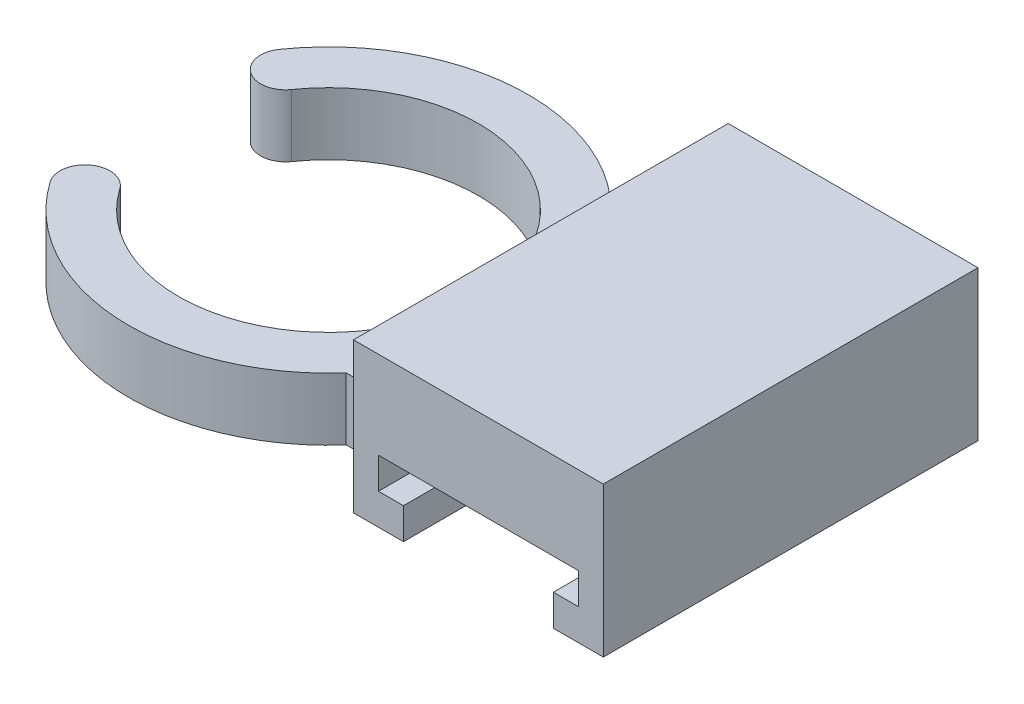
ISO-10303-21;
HEADER;
FILE_DESCRIPTION(('STEP AP214'),'2;1');
FILE_NAME('part.step','',(''),(''),'','','');
FILE_SCHEMA(('AUTOMOTIVE_DESIGN { 1 0 10303 214 1 1 1 1 }'));
ENDSEC;
DATA;
#1=APPLICATION_CONTEXT('core data for automotive mechanical design processes');
#2=APPLICATION_PROTOCOL_DEFINITION('international standard','automotive_design',2000,#1);
#3=PRODUCT_CONTEXT('',#1,'mechanical');
#4=PRODUCT('Part','Part','',(#3));
#5=PRODUCT_RELATED_PRODUCT_CATEGORY('part','',(#4));
#6=PRODUCT_DEFINITION_FORMATION('','',#4);
#7=PRODUCT_DEFINITION_CONTEXT('part definition',#1,'design');
#8=PRODUCT_DEFINITION('design','',#6,#7);
#9=PRODUCT_DEFINITION_SHAPE('','',#8);
#10=(LENGTH_UNIT() NAMED_UNIT(*) SI_UNIT(.MILLI.,.METRE.));
#11=(NAMED_UNIT(*) PLANE_ANGLE_UNIT() SI_UNIT($,.RADIAN.));
#12=(NAMED_UNIT(*) SI_UNIT($,.STERADIAN.) SOLID_ANGLE_UNIT());
#13=UNCERTAINTY_MEASURE_WITH_UNIT(LENGTH_MEASURE(1.E-05),#10,'distance_accuracy_value','');
#14=(GEOMETRIC_REPRESENTATION_CONTEXT(3) GLOBAL_UNCERTAINTY_ASSIGNED_CONTEXT((#13)) GLOBAL_UNIT_ASSIGNED_CONTEXT((#10,
#11,#12)) REPRESENTATION_CONTEXT('',''));
#15=CARTESIAN_POINT('',(0.,0.,0.));
#16=DIRECTION('',(0.,0.,1.));
#17=DIRECTION('',(1.,0.,0.));
#18=AXIS2_PLACEMENT_3D('',#15,#16,#17);
#19=CARTESIAN_POINT('',(-19.7321469764376,-1.59822046465645,60.));
#20=DIRECTION('',(1.,0.,0.));
#21=DIRECTION('',(0.,0.,-1.));
#22=AXIS2_PLACEMENT_3D('',#19,#20,#21);
#23=PLANE('',#22);
#24=DIRECTION('',(0.,-1.,0.));
#25=VECTOR('',#24,1.);
#26=CARTESIAN_POINT('',(-19.7321469764376,8.40177953534354,8.83398951148327));
#27=LINE('',#26,#25);
#28=CARTESIAN_POINT('',(-19.7321469764376,8.40177953534354,8.83398951148327));
#29=VERTEX_POINT('',#28);
#30=CARTESIAN_POINT('',(-19.7321469764376,-1.59822046465645,8.83398951148327));
#31=VERTEX_POINT('',#30);
#32=EDGE_CURVE('E295',#29,#31,#27,.T.);
#33=ORIENTED_EDGE('',*,*,#32,.F.);
#34=DIRECTION('',(0.,0.,-1.));
#35=VECTOR('',#34,1.);
#36=CARTESIAN_POINT('',(-19.7321469764376,8.40177953534354,0.));
#37=LINE('',#36,#35);
#38=CARTESIAN_POINT('',(-19.7321469764376,8.40177953534354,51.1660104885167));
#39=VERTEX_POINT('',#38);
#40=EDGE_CURVE('E280',#39,#29,#37,.T.);
#41=ORIENTED_EDGE('',*,*,#40,.F.);
#42=DIRECTION('',(0.,-1.,0.));
#43=VECTOR('',#42,1.);
#44=CARTESIAN_POINT('',(-19.7321469764376,8.40177953534354,51.1660104885167));
#45=LINE('',#44,#43);
#46=CARTESIAN_POINT('',(-19.7321469764376,-1.59822046465645,51.1660104885167));
#47=VERTEX_POINT('',#46);
#48=EDGE_CURVE('E171',#39,#47,#45,.T.);
#49=ORIENTED_EDGE('',*,*,#48,.T.);
#50=DIRECTION('',(0.,0.,-1.));
#51=VECTOR('',#50,1.);
#52=CARTESIAN_POINT('',(-19.7321469764376,-1.59822046465645,60.));
#53=LINE('',#52,#51);
#54=CARTESIAN_POINT('',(-19.7321469764376,-1.59822046465645,60.));
#55=VERTEX_POINT('',#54);
#56=EDGE_CURVE('E11',#55,#47,#53,.T.);
#57=ORIENTED_EDGE('',*,*,#56,.F.);
#58=DIRECTION('',(0.,-1.,0.));
#59=VECTOR('',#58,1.);
#60=CARTESIAN_POINT('',(-19.7321469764376,-1.59822046465645,60.));
#61=LINE('',#60,#59);
#62=CARTESIAN_POINT('',(-19.7321469764376,22.4017795353436,60.));
#63=VERTEX_POINT('',#62);
#64=EDGE_CURVE('E191',#63,#55,#61,.T.);
#65=ORIENTED_EDGE('',*,*,#64,.F.);
#66=DIRECTION('',(0.,0.,-1.));
#67=VECTOR('',#66,1.);
#68=CARTESIAN_POINT('',(-19.7321469764376,22.4017795353436,60.));
#69=LINE('',#68,#67);
#70=CARTESIAN_POINT('',(-19.7321469764376,22.4017795353436,0.));
#71=VERTEX_POINT('',#70);
#72=EDGE_CURVE('E163',#63,#71,#69,.T.);
#73=ORIENTED_EDGE('',*,*,#72,.T.);
#74=DIRECTION('',(0.,-1.,0.));
#75=VECTOR('',#74,1.);
#76=CARTESIAN_POINT('',(-19.7321469764376,-1.59822046465645,0.));
#77=LINE('',#76,#75);
#78=CARTESIAN_POINT('',(-19.7321469764376,-1.59822046465645,0.));
#79=VERTEX_POINT('',#78);
#80=EDGE_CURVE('E167',#71,#79,#77,.T.);
#81=ORIENTED_EDGE('',*,*,#80,.T.);
#82=EDGE_CURVE('E42',#31,#79,#53,.T.);
#83=ORIENTED_EDGE('',*,*,#82,.F.);
#84=EDGE_LOOP('',(#33,#41,#49,#57,#65,#73,#81,#83));
#85=FACE_BOUND('',#84,.T.);
#86=ADVANCED_FACE('F35',(#85),#23,.F.);
#87=CARTESIAN_POINT('',(-19.7321469764376,-1.59822046465645,60.));
#88=DIRECTION('',(0.,1.,0.));
#89=DIRECTION('',(0.,0.,1.));
#90=AXIS2_PLACEMENT_3D('',#87,#88,#89);
#91=PLANE('',#90);
#92=DIRECTION('',(1.,0.,0.));
#93=VECTOR('',#92,1.);
#94=CARTESIAN_POINT('',(-19.7321469764376,-1.59822046465645,0.));
#95=LINE('',#94,#93);
#96=CARTESIAN_POINT('',(-11.7321469764376,-1.59822046465645,0.));
#97=VERTEX_POINT('',#96);
#98=EDGE_CURVE('E170',#79,#97,#95,.T.);
#99=ORIENTED_EDGE('',*,*,#98,.T.);
#100=DIRECTION('',(0.,0.,-1.));
#101=VECTOR('',#100,1.);
#102=CARTESIAN_POINT('',(-11.7321469764376,-1.59822046465645,60.));
#103=LINE('',#102,#101);
#104=CARTESIAN_POINT('',(-11.7321469764376,-1.59822046465645,60.));
#105=VERTEX_POINT('',#104);
#106=EDGE_CURVE('E212',#105,#97,#103,.T.);
#107=ORIENTED_EDGE('',*,*,#106,.F.);
#108=DIRECTION('',(1.,0.,0.));
#109=VECTOR('',#108,1.);
#110=CARTESIAN_POINT('',(-19.7321469764376,-1.59822046465645,60.));
#111=LINE('',#110,#109);
#112=EDGE_CURVE('E111',#55,#105,#111,.T.);
#113=ORIENTED_EDGE('',*,*,#112,.F.);
#114=ORIENTED_EDGE('',*,*,#56,.T.);
#115=DIRECTION('',(1.,0.,0.));
#116=VECTOR('',#115,1.);
#117=CARTESIAN_POINT('',(0.,-1.59822046465645,51.1660104885167));
#118=LINE('',#117,#116);
#119=CARTESIAN_POINT('',(-29.7321469764377,-1.59822046465645,51.1660104885167));
#120=VERTEX_POINT('',#119);
#121=EDGE_CURVE('E49',#120,#47,#118,.T.);
#122=ORIENTED_EDGE('',*,*,#121,.F.);
#123=CARTESIAN_POINT('',(-53.7321469764376,-1.59822046465645,30.));
#124=DIRECTION('',(0.,-1.,0.));
#125=DIRECTION('',(0.,0.,-1.));
#126=AXIS2_PLACEMENT_3D('',#123,#124,#125);
#127=CIRCLE('',#126,32.);
#128=CARTESIAN_POINT('',(-79.9450123936855,-1.59822046465645,48.3544459632333));
#129=VERTEX_POINT('',#128);
#130=EDGE_CURVE('E312',#120,#129,#127,.T.);
#131=ORIENTED_EDGE('',*,*,#130,.T.);
#132=CARTESIAN_POINT('',(-76.6684042165295,-1.59822046465645,46.0601402178292));
#133=DIRECTION('',(0.,-1.,0.));
#134=DIRECTION('',(0.,0.,-1.));
#135=AXIS2_PLACEMENT_3D('',#132,#133,#134);
#136=CIRCLE('',#135,4.);
#137=CARTESIAN_POINT('',(-73.3917960393735,-1.59822046465645,43.765834472425));
#138=VERTEX_POINT('',#137);
#139=EDGE_CURVE('E309',#129,#138,#136,.T.);
#140=ORIENTED_EDGE('',*,*,#139,.T.);
#141=CARTESIAN_POINT('',(-53.7321469764376,-1.59822046465645,30.));
#142=DIRECTION('',(0.,-1.,0.));
#143=DIRECTION('',(0.,0.,-1.));
#144=AXIS2_PLACEMENT_3D('',#141,#142,#143);
#145=CIRCLE('',#144,24.);
#146=CARTESIAN_POINT('',(-73.3917960393735,-1.59822046465645,16.234165527575));
#147=VERTEX_POINT('',#146);
#148=EDGE_CURVE('E306',#147,#138,#145,.T.);
#149=ORIENTED_EDGE('',*,*,#148,.F.);
#150=CARTESIAN_POINT('',(-76.6684042165295,-1.59822046465645,13.9398597821708));
#151=DIRECTION('',(0.,-1.,0.));
#152=DIRECTION('',(0.,0.,-1.));
#153=AXIS2_PLACEMENT_3D('',#150,#151,#152);
#154=CIRCLE('',#153,4.);
#155=CARTESIAN_POINT('',(-79.9450123936855,-1.59822046465645,11.6455540367667));
#156=VERTEX_POINT('',#155);
#157=EDGE_CURVE('E303',#156,#147,#154,.F.);
#158=ORIENTED_EDGE('',*,*,#157,.F.);
#159=CARTESIAN_POINT('',(-53.7321469764376,-1.59822046465645,30.));
#160=DIRECTION('',(0.,-1.,0.));
#161=DIRECTION('',(0.,0.,-1.));
#162=AXIS2_PLACEMENT_3D('',#159,#160,#161);
#163=CIRCLE('',#162,32.);
#164=CARTESIAN_POINT('',(-29.7321469764377,-1.59822046465645,8.83398951148328));
#165=VERTEX_POINT('',#164);
#166=EDGE_CURVE('E301',#156,#165,#163,.T.);
#167=ORIENTED_EDGE('',*,*,#166,.T.);
#168=DIRECTION('',(-1.,0.,0.));
#169=VECTOR('',#168,1.);
#170=CARTESIAN_POINT('',(0.,-1.59822046465645,8.83398951148327));
#171=LINE('',#170,#169);
#172=EDGE_CURVE('E223',#31,#165,#171,.T.);
#173=ORIENTED_EDGE('',*,*,#172,.F.);
#174=ORIENTED_EDGE('',*,*,#82,.T.);
#175=EDGE_LOOP('',(#99,#107,#113,#114,#122,#131,#140,#149,#158,#167,#173,#174));
#176=FACE_BOUND('',#175,.T.);
#177=ADVANCED_FACE('F220',(#176),#91,.F.);
#178=CARTESIAN_POINT('',(-11.7321469764376,-1.59822046465645,60.));
#179=DIRECTION('',(-1.,0.,0.));
#180=DIRECTION('',(0.,0.,1.));
#181=AXIS2_PLACEMENT_3D('',#178,#179,#180);
#182=PLANE('',#181);
#183=DIRECTION('',(0.,1.,0.));
#184=VECTOR('',#183,1.);
#185=CARTESIAN_POINT('',(-11.7321469764376,-1.59822046465645,0.));
#186=LINE('',#185,#184);
#187=CARTESIAN_POINT('',(-11.7321469764376,3.40177953534355,0.));
#188=VERTEX_POINT('',#187);
#189=EDGE_CURVE('E173',#97,#188,#186,.T.);
#190=ORIENTED_EDGE('',*,*,#189,.T.);
#191=DIRECTION('',(0.,0.,-1.));
#192=VECTOR('',#191,1.);
#193=CARTESIAN_POINT('',(-11.7321469764376,3.40177953534355,60.));
#194=LINE('',#193,#192);
#195=CARTESIAN_POINT('',(-11.7321469764376,3.40177953534355,60.));
#196=VERTEX_POINT('',#195);
#197=EDGE_CURVE('E210',#196,#188,#194,.T.);
#198=ORIENTED_EDGE('',*,*,#197,.F.);
#199=DIRECTION('',(0.,1.,0.));
#200=VECTOR('',#199,1.);
#201=CARTESIAN_POINT('',(-11.7321469764376,-1.59822046465645,60.));
#202=LINE('',#201,#200);
#203=EDGE_CURVE('E267',#105,#196,#202,.T.);
#204=ORIENTED_EDGE('',*,*,#203,.F.);
#205=ORIENTED_EDGE('',*,*,#106,.T.);
#206=EDGE_LOOP('',(#190,#198,#204,#205));
#207=FACE_BOUND('',#206,.T.);
#208=ADVANCED_FACE('F266',(#207),#182,.F.);
#209=CARTESIAN_POINT('',(-11.7321469764376,3.40177953534355,60.));
#210=DIRECTION('',(0.,-1.,0.));
#211=DIRECTION('',(0.,0.,-1.));
#212=AXIS2_PLACEMENT_3D('',#209,#210,#211);
#213=PLANE('',#212);
#214=DIRECTION('',(-1.,0.,0.));
#215=VECTOR('',#214,1.);
#216=CARTESIAN_POINT('',(-11.7321469764376,3.40177953534355,0.));
#217=LINE('',#216,#215);
#218=CARTESIAN_POINT('',(-15.7321469764376,3.40177953534355,0.));
#219=VERTEX_POINT('',#218);
#220=EDGE_CURVE('E175',#188,#219,#217,.T.);
#221=ORIENTED_EDGE('',*,*,#220,.T.);
#222=DIRECTION('',(0.,0.,-1.));
#223=VECTOR('',#222,1.);
#224=CARTESIAN_POINT('',(-15.7321469764376,3.40177953534355,60.));
#225=LINE('',#224,#223);
#226=CARTESIAN_POINT('',(-15.7321469764376,3.40177953534355,60.));
#227=VERTEX_POINT('',#226);
#228=EDGE_CURVE('E207',#227,#219,#225,.T.);
#229=ORIENTED_EDGE('',*,*,#228,.F.);
#230=DIRECTION('',(-1.,0.,0.));
#231=VECTOR('',#230,1.);
#232=CARTESIAN_POINT('',(-11.7321469764376,3.40177953534355,60.));
#233=LINE('',#232,#231);
#234=EDGE_CURVE('E264',#196,#227,#233,.T.);
#235=ORIENTED_EDGE('',*,*,#234,.F.);
#236=ORIENTED_EDGE('',*,*,#197,.T.);
#237=EDGE_LOOP('',(#221,#229,#235,#236));
#238=FACE_BOUND('',#237,.T.);
#239=ADVANCED_FACE('F263',(#238),#213,.F.);
#240=CARTESIAN_POINT('',(-15.7321469764376,3.40177953534355,60.));
#241=DIRECTION('',(-1.,0.,0.));
#242=DIRECTION('',(0.,0.,1.));
#243=AXIS2_PLACEMENT_3D('',#240,#241,#242);
#244=PLANE('',#243);
#245=DIRECTION('',(0.,1.,0.));
#246=VECTOR('',#245,1.);
#247=CARTESIAN_POINT('',(-15.7321469764376,3.40177953534355,0.));
#248=LINE('',#247,#246);
#249=CARTESIAN_POINT('',(-15.7321469764376,8.40177953534355,0.));
#250=VERTEX_POINT('',#249);
#251=EDGE_CURVE('E177',#219,#250,#248,.T.);
#252=ORIENTED_EDGE('',*,*,#251,.T.);
#253=DIRECTION('',(0.,0.,-1.));
#254=VECTOR('',#253,1.);
#255=CARTESIAN_POINT('',(-15.7321469764376,8.40177953534355,60.));
#256=LINE('',#255,#254);
#257=CARTESIAN_POINT('',(-15.7321469764376,8.40177953534355,60.));
#258=VERTEX_POINT('',#257);
#259=EDGE_CURVE('E204',#258,#250,#256,.T.);
#260=ORIENTED_EDGE('',*,*,#259,.F.);
#261=DIRECTION('',(0.,1.,0.));
#262=VECTOR('',#261,1.);
#263=CARTESIAN_POINT('',(-15.7321469764376,3.40177953534355,60.));
#264=LINE('',#263,#262);
#265=EDGE_CURVE('E259',#227,#258,#264,.T.);
#266=ORIENTED_EDGE('',*,*,#265,.F.);
#267=ORIENTED_EDGE('',*,*,#228,.T.);
#268=EDGE_LOOP('',(#252,#260,#266,#267));
#269=FACE_BOUND('',#268,.T.);
#270=ADVANCED_FACE('F258',(#269),#244,.F.);
#271=CARTESIAN_POINT('',(-15.7321469764376,8.40177953534355,60.));
#272=DIRECTION('',(0.,1.,0.));
#273=DIRECTION('',(0.,0.,1.));
#274=AXIS2_PLACEMENT_3D('',#271,#272,#273);
#275=PLANE('',#274);
#276=DIRECTION('',(1.,0.,0.));
#277=VECTOR('',#276,1.);
#278=CARTESIAN_POINT('',(-15.7321469764376,8.40177953534355,0.));
#279=LINE('',#278,#277);
#280=CARTESIAN_POINT('',(16.2678530235624,8.40177953534355,0.));
#281=VERTEX_POINT('',#280);
#282=EDGE_CURVE('E179',#250,#281,#279,.T.);
#283=ORIENTED_EDGE('',*,*,#282,.T.);
#284=DIRECTION('',(0.,0.,-1.));
#285=VECTOR('',#284,1.);
#286=CARTESIAN_POINT('',(16.2678530235624,8.40177953534355,60.));
#287=LINE('',#286,#285);
#288=CARTESIAN_POINT('',(16.2678530235624,8.40177953534355,60.));
#289=VERTEX_POINT('',#288);
#290=EDGE_CURVE('E201',#289,#281,#287,.T.);
#291=ORIENTED_EDGE('',*,*,#290,.F.);
#292=DIRECTION('',(1.,0.,0.));
#293=VECTOR('',#292,1.);
#294=CARTESIAN_POINT('',(-15.7321469764376,8.40177953534355,60.));
#295=LINE('',#294,#293);
#296=EDGE_CURVE('E255',#258,#289,#295,.T.);
#297=ORIENTED_EDGE('',*,*,#296,.F.);
#298=ORIENTED_EDGE('',*,*,#259,.T.);
#299=EDGE_LOOP('',(#283,#291,#297,#298));
#300=FACE_BOUND('',#299,.T.);
#301=ADVANCED_FACE('F252',(#300),#275,.F.);
#302=CARTESIAN_POINT('',(16.2678530235624,3.40177953534355,60.));
#303=DIRECTION('',(1.,0.,0.));
#304=DIRECTION('',(0.,0.,-1.));
#305=AXIS2_PLACEMENT_3D('',#302,#303,#304);
#306=PLANE('',#305);
#307=DIRECTION('',(0.,-1.,0.));
#308=VECTOR('',#307,1.);
#309=CARTESIAN_POINT('',(16.2678530235624,3.40177953534355,0.));
#310=LINE('',#309,#308);
#311=CARTESIAN_POINT('',(16.2678530235624,3.40177953534355,0.));
#312=VERTEX_POINT('',#311);
#313=EDGE_CURVE('E181',#281,#312,#310,.T.);
#314=ORIENTED_EDGE('',*,*,#313,.T.);
#315=DIRECTION('',(0.,0.,-1.));
#316=VECTOR('',#315,1.);
#317=CARTESIAN_POINT('',(16.2678530235624,3.40177953534355,60.));
#318=LINE('',#317,#316);
#319=CARTESIAN_POINT('',(16.2678530235624,3.40177953534355,60.));
#320=VERTEX_POINT('',#319);
#321=EDGE_CURVE('E198',#320,#312,#318,.T.);
#322=ORIENTED_EDGE('',*,*,#321,.F.);
#323=DIRECTION('',(0.,-1.,0.));
#324=VECTOR('',#323,1.);
#325=CARTESIAN_POINT('',(16.2678530235624,3.40177953534355,60.));
#326=LINE('',#325,#324);
#327=EDGE_CURVE('E247',#289,#320,#326,.T.);
#328=ORIENTED_EDGE('',*,*,#327,.F.);
#329=ORIENTED_EDGE('',*,*,#290,.T.);
#330=EDGE_LOOP('',(#314,#322,#328,#329));
#331=FACE_BOUND('',#330,.T.);
#332=ADVANCED_FACE('F246',(#331),#306,.F.);
#333=CARTESIAN_POINT('',(12.2678530235624,3.40177953534355,60.));
#334=DIRECTION('',(0.,-1.,0.));
#335=DIRECTION('',(0.,0.,-1.));
#336=AXIS2_PLACEMENT_3D('',#333,#334,#335);
#337=PLANE('',#336);
#338=DIRECTION('',(-1.,0.,0.));
#339=VECTOR('',#338,1.);
#340=CARTESIAN_POINT('',(12.2678530235624,3.40177953534355,0.));
#341=LINE('',#340,#339);
#342=CARTESIAN_POINT('',(12.2678530235624,3.40177953534355,0.));
#343=VERTEX_POINT('',#342);
#344=EDGE_CURVE('E183',#312,#343,#341,.T.);
#345=ORIENTED_EDGE('',*,*,#344,.T.);
#346=DIRECTION('',(0.,0.,-1.));
#347=VECTOR('',#346,1.);
#348=CARTESIAN_POINT('',(12.2678530235624,3.40177953534355,60.));
#349=LINE('',#348,#347);
#350=CARTESIAN_POINT('',(12.2678530235624,3.40177953534355,60.));
#351=VERTEX_POINT('',#350);
#352=EDGE_CURVE('E195',#351,#343,#349,.T.);
#353=ORIENTED_EDGE('',*,*,#352,.F.);
#354=DIRECTION('',(-1.,0.,0.));
#355=VECTOR('',#354,1.);
#356=CARTESIAN_POINT('',(12.2678530235624,3.40177953534355,60.));
#357=LINE('',#356,#355);
#358=EDGE_CURVE('E242',#320,#351,#357,.T.);
#359=ORIENTED_EDGE('',*,*,#358,.F.);
#360=ORIENTED_EDGE('',*,*,#321,.T.);
#361=EDGE_LOOP('',(#345,#353,#359,#360));
#362=FACE_BOUND('',#361,.T.);
#363=ADVANCED_FACE('F241',(#362),#337,.F.);
#364=CARTESIAN_POINT('',(12.2678530235624,-1.59822046465645,60.));
#365=DIRECTION('',(1.,0.,0.));
#366=DIRECTION('',(0.,0.,-1.));
#367=AXIS2_PLACEMENT_3D('',#364,#365,#366);
#368=PLANE('',#367);
#369=DIRECTION('',(0.,-1.,0.));
#370=VECTOR('',#369,1.);
#371=CARTESIAN_POINT('',(12.2678530235624,-1.59822046465645,0.));
#372=LINE('',#371,#370);
#373=CARTESIAN_POINT('',(12.2678530235624,-1.59822046465645,0.));
#374=VERTEX_POINT('',#373);
#375=EDGE_CURVE('E185',#343,#374,#372,.T.);
#376=ORIENTED_EDGE('',*,*,#375,.T.);
#377=DIRECTION('',(0.,0.,-1.));
#378=VECTOR('',#377,1.);
#379=CARTESIAN_POINT('',(12.2678530235624,-1.59822046465645,60.));
#380=LINE('',#379,#378);
#381=CARTESIAN_POINT('',(12.2678530235624,-1.59822046465645,60.));
#382=VERTEX_POINT('',#381);
#383=EDGE_CURVE('E158',#382,#374,#380,.T.);
#384=ORIENTED_EDGE('',*,*,#383,.F.);
#385=DIRECTION('',(0.,-1.,0.));
#386=VECTOR('',#385,1.);
#387=CARTESIAN_POINT('',(12.2678530235624,-1.59822046465645,60.));
#388=LINE('',#387,#386);
#389=EDGE_CURVE('E146',#351,#382,#388,.T.);
#390=ORIENTED_EDGE('',*,*,#389,.F.);
#391=ORIENTED_EDGE('',*,*,#352,.T.);
#392=EDGE_LOOP('',(#376,#384,#390,#391));
#393=FACE_BOUND('',#392,.T.);
#394=ADVANCED_FACE('F237',(#393),#368,.F.);
#395=CARTESIAN_POINT('',(20.2678530235624,-1.59822046465645,60.));
#396=DIRECTION('',(0.,1.,0.));
#397=DIRECTION('',(0.,0.,1.));
#398=AXIS2_PLACEMENT_3D('',#395,#396,#397);
#399=PLANE('',#398);
#400=DIRECTION('',(1.,0.,0.));
#401=VECTOR('',#400,1.);
#402=CARTESIAN_POINT('',(20.2678530235624,-1.59822046465645,0.));
#403=LINE('',#402,#401);
#404=CARTESIAN_POINT('',(20.2678530235624,-1.59822046465645,0.));
#405=VERTEX_POINT('',#404);
#406=EDGE_CURVE('E155',#374,#405,#403,.T.);
#407=ORIENTED_EDGE('',*,*,#406,.T.);
#408=DIRECTION('',(0.,0.,-1.));
#409=VECTOR('',#408,1.);
#410=CARTESIAN_POINT('',(20.2678530235624,-1.59822046465645,60.));
#411=LINE('',#410,#409);
#412=CARTESIAN_POINT('',(20.2678530235624,-1.59822046465645,60.));
#413=VERTEX_POINT('',#412);
#414=EDGE_CURVE('E152',#413,#405,#411,.T.);
#415=ORIENTED_EDGE('',*,*,#414,.F.);
#416=DIRECTION('',(1.,0.,0.));
#417=VECTOR('',#416,1.);
#418=CARTESIAN_POINT('',(20.2678530235624,-1.59822046465645,60.));
#419=LINE('',#418,#417);
#420=EDGE_CURVE('E139',#382,#413,#419,.T.);
#421=ORIENTED_EDGE('',*,*,#420,.F.);
#422=ORIENTED_EDGE('',*,*,#383,.T.);
#423=EDGE_LOOP('',(#407,#415,#421,#422));
#424=FACE_BOUND('',#423,.T.);
#425=ADVANCED_FACE('F153',(#424),#399,.F.);
#426=CARTESIAN_POINT('',(20.2678530235624,22.4017795353436,60.));
#427=DIRECTION('',(-1.,0.,0.));
#428=DIRECTION('',(0.,0.,1.));
#429=AXIS2_PLACEMENT_3D('',#426,#427,#428);
#430=PLANE('',#429);
#431=DIRECTION('',(0.,1.,0.));
#432=VECTOR('',#431,1.);
#433=CARTESIAN_POINT('',(20.2678530235624,22.4017795353436,0.));
#434=LINE('',#433,#432);
#435=CARTESIAN_POINT('',(20.2678530235624,22.4017795353436,0.));
#436=VERTEX_POINT('',#435);
#437=EDGE_CURVE('E188',#405,#436,#434,.T.);
#438=ORIENTED_EDGE('',*,*,#437,.T.);
#439=DIRECTION('',(0.,0.,-1.));
#440=VECTOR('',#439,1.);
#441=CARTESIAN_POINT('',(20.2678530235624,22.4017795353436,60.));
#442=LINE('',#441,#440);
#443=CARTESIAN_POINT('',(20.2678530235624,22.4017795353436,60.));
#444=VERTEX_POINT('',#443);
#445=EDGE_CURVE('E159',#444,#436,#442,.T.);
#446=ORIENTED_EDGE('',*,*,#445,.F.);
#447=DIRECTION('',(0.,1.,0.));
#448=VECTOR('',#447,1.);
#449=CARTESIAN_POINT('',(20.2678530235624,22.4017795353436,60.));
#450=LINE('',#449,#448);
#451=EDGE_CURVE('E143',#413,#444,#450,.T.);
#452=ORIENTED_EDGE('',*,*,#451,.F.);
#453=ORIENTED_EDGE('',*,*,#414,.T.);
#454=EDGE_LOOP('',(#438,#446,#452,#453));
#455=FACE_BOUND('',#454,.T.);
#456=ADVANCED_FACE('F161',(#455),#430,.F.);
#457=CARTESIAN_POINT('',(-19.7321469764376,22.4017795353436,60.));
#458=DIRECTION('',(0.,-1.,0.));
#459=DIRECTION('',(0.,0.,-1.));
#460=AXIS2_PLACEMENT_3D('',#457,#458,#459);
#461=PLANE('',#460);
#462=DIRECTION('',(-1.,0.,0.));
#463=VECTOR('',#462,1.);
#464=CARTESIAN_POINT('',(-19.7321469764376,22.4017795353436,0.));
#465=LINE('',#464,#463);
#466=EDGE_CURVE('E103',#436,#71,#465,.T.);
#467=ORIENTED_EDGE('',*,*,#466,.T.);
#468=ORIENTED_EDGE('',*,*,#72,.F.);
#469=DIRECTION('',(-1.,0.,0.));
#470=VECTOR('',#469,1.);
#471=CARTESIAN_POINT('',(-19.7321469764376,22.4017795353436,60.));
#472=LINE('',#471,#470);
#473=EDGE_CURVE('E58',#444,#63,#472,.T.);
#474=ORIENTED_EDGE('',*,*,#473,.F.);
#475=ORIENTED_EDGE('',*,*,#445,.T.);
#476=EDGE_LOOP('',(#467,#468,#474,#475));
#477=FACE_BOUND('',#476,.T.);
#478=ADVANCED_FACE('F232',(#477),#461,.F.);
#479=CARTESIAN_POINT('',(0.,0.,60.));
#480=DIRECTION('',(0.,0.,-1.));
#481=DIRECTION('',(-1.,0.,0.));
#482=AXIS2_PLACEMENT_3D('',#479,#480,#481);
#483=PLANE('',#482);
#484=ORIENTED_EDGE('',*,*,#64,.T.);
#485=ORIENTED_EDGE('',*,*,#112,.T.);
#486=ORIENTED_EDGE('',*,*,#203,.T.);
#487=ORIENTED_EDGE('',*,*,#234,.T.);
#488=ORIENTED_EDGE('',*,*,#265,.T.);
#489=ORIENTED_EDGE('',*,*,#296,.T.);
#490=ORIENTED_EDGE('',*,*,#327,.T.);
#491=ORIENTED_EDGE('',*,*,#358,.T.);
#492=ORIENTED_EDGE('',*,*,#389,.T.);
#493=ORIENTED_EDGE('',*,*,#420,.T.);
#494=ORIENTED_EDGE('',*,*,#451,.T.);
#495=ORIENTED_EDGE('',*,*,#473,.T.);
#496=EDGE_LOOP('',(#484,#485,#486,#487,#488,#489,#490,#491,#492,#493,#494,#495));
#497=FACE_BOUND('',#496,.T.);
#498=ADVANCED_FACE('F141',(#497),#483,.F.);
#499=CARTESIAN_POINT('',(0.,0.,0.));
#500=DIRECTION('',(0.,0.,-1.));
#501=DIRECTION('',(-1.,0.,0.));
#502=AXIS2_PLACEMENT_3D('',#499,#500,#501);
#503=PLANE('',#502);
#504=ORIENTED_EDGE('',*,*,#80,.F.);
#505=ORIENTED_EDGE('',*,*,#466,.F.);
#506=ORIENTED_EDGE('',*,*,#437,.F.);
#507=ORIENTED_EDGE('',*,*,#406,.F.);
#508=ORIENTED_EDGE('',*,*,#375,.F.);
#509=ORIENTED_EDGE('',*,*,#344,.F.);
#510=ORIENTED_EDGE('',*,*,#313,.F.);
#511=ORIENTED_EDGE('',*,*,#282,.F.);
#512=ORIENTED_EDGE('',*,*,#251,.F.);
#513=ORIENTED_EDGE('',*,*,#220,.F.);
#514=ORIENTED_EDGE('',*,*,#189,.F.);
#515=ORIENTED_EDGE('',*,*,#98,.F.);
#516=EDGE_LOOP('',(#504,#505,#506,#507,#508,#509,#510,#511,#512,#513,#514,#515));
#517=FACE_BOUND('',#516,.T.);
#518=ADVANCED_FACE('F228',(#517),#503,.T.);
#519=CARTESIAN_POINT('',(0.,8.40177953534354,51.1660104885167));
#520=DIRECTION('',(0.,0.,-1.));
#521=DIRECTION('',(-1.,0.,0.));
#522=AXIS2_PLACEMENT_3D('',#519,#520,#521);
#523=PLANE('',#522);
#524=ORIENTED_EDGE('',*,*,#121,.T.);
#525=ORIENTED_EDGE('',*,*,#48,.F.);
#526=DIRECTION('',(1.,0.,0.));
#527=VECTOR('',#526,1.);
#528=CARTESIAN_POINT('',(0.,8.40177953534354,51.1660104885167));
#529=LINE('',#528,#527);
#530=CARTESIAN_POINT('',(-29.7321469764377,8.40177953534354,51.1660104885167));
#531=VERTEX_POINT('',#530);
#532=EDGE_CURVE('E300',#531,#39,#529,.T.);
#533=ORIENTED_EDGE('',*,*,#532,.F.);
#534=DIRECTION('',(0.,-1.,0.));
#535=VECTOR('',#534,1.);
#536=CARTESIAN_POINT('',(-29.7321469764377,8.40177953534354,51.1660104885167));
#537=LINE('',#536,#535);
#538=EDGE_CURVE('E277',#531,#120,#537,.T.);
#539=ORIENTED_EDGE('',*,*,#538,.T.);
#540=EDGE_LOOP('',(#524,#525,#533,#539));
#541=FACE_BOUND('',#540,.T.);
#542=ADVANCED_FACE('F347',(#541),#523,.F.);
#543=CARTESIAN_POINT('',(0.,8.40177953534354,8.83398951148327));
#544=DIRECTION('',(0.,0.,1.));
#545=DIRECTION('',(1.,0.,0.));
#546=AXIS2_PLACEMENT_3D('',#543,#544,#545);
#547=PLANE('',#546);
#548=ORIENTED_EDGE('',*,*,#172,.T.);
#549=DIRECTION('',(0.,-1.,0.));
#550=VECTOR('',#549,1.);
#551=CARTESIAN_POINT('',(-29.7321469764377,8.40177953534354,8.83398951148328));
#552=LINE('',#551,#550);
#553=CARTESIAN_POINT('',(-29.7321469764377,8.40177953534354,8.83398951148328));
#554=VERTEX_POINT('',#553);
#555=EDGE_CURVE('E292',#554,#165,#552,.T.);
#556=ORIENTED_EDGE('',*,*,#555,.F.);
#557=DIRECTION('',(-1.,0.,0.));
#558=VECTOR('',#557,1.);
#559=CARTESIAN_POINT('',(0.,8.40177953534354,8.83398951148327));
#560=LINE('',#559,#558);
#561=EDGE_CURVE('E318',#29,#554,#560,.T.);
#562=ORIENTED_EDGE('',*,*,#561,.F.);
#563=ORIENTED_EDGE('',*,*,#32,.T.);
#564=EDGE_LOOP('',(#548,#556,#562,#563));
#565=FACE_BOUND('',#564,.T.);
#566=ADVANCED_FACE('F351',(#565),#547,.F.);
#567=CARTESIAN_POINT('',(-53.7321469764376,8.40177953534354,30.));
#568=DIRECTION('',(0.,-1.,0.));
#569=DIRECTION('',(0.,0.,-1.));
#570=AXIS2_PLACEMENT_3D('',#567,#568,#569);
#571=CYLINDRICAL_SURFACE('',#570,32.);
#572=ORIENTED_EDGE('',*,*,#166,.F.);
#573=DIRECTION('',(0.,-1.,0.));
#574=VECTOR('',#573,1.);
#575=CARTESIAN_POINT('',(-79.9450123936855,8.40177953534354,11.6455540367667));
#576=LINE('',#575,#574);
#577=CARTESIAN_POINT('',(-79.9450123936855,8.40177953534354,11.6455540367667));
#578=VERTEX_POINT('',#577);
#579=EDGE_CURVE('E289',#578,#156,#576,.T.);
#580=ORIENTED_EDGE('',*,*,#579,.F.);
#581=CARTESIAN_POINT('',(-53.7321469764376,8.40177953534354,30.));
#582=DIRECTION('',(0.,-1.,0.));
#583=DIRECTION('',(0.,0.,-1.));
#584=AXIS2_PLACEMENT_3D('',#581,#582,#583);
#585=CIRCLE('',#584,32.);
#586=EDGE_CURVE('E321',#578,#554,#585,.T.);
#587=ORIENTED_EDGE('',*,*,#586,.T.);
#588=ORIENTED_EDGE('',*,*,#555,.T.);
#589=EDGE_LOOP('',(#572,#580,#587,#588));
#590=FACE_BOUND('',#589,.T.);
#591=ADVANCED_FACE('F396',(#590),#571,.T.);
#592=CARTESIAN_POINT('',(-76.6684042165295,8.40177953534354,13.9398597821708));
#593=DIRECTION('',(0.,-1.,0.));
#594=DIRECTION('',(0.,0.,-1.));
#595=AXIS2_PLACEMENT_3D('',#592,#593,#594);
#596=CYLINDRICAL_SURFACE('',#595,4.);
#597=ORIENTED_EDGE('',*,*,#157,.T.);
#598=DIRECTION('',(0.,-1.,0.));
#599=VECTOR('',#598,1.);
#600=CARTESIAN_POINT('',(-73.3917960393735,8.40177953534354,16.234165527575));
#601=LINE('',#600,#599);
#602=CARTESIAN_POINT('',(-73.3917960393735,8.40177953534354,16.234165527575));
#603=VERTEX_POINT('',#602);
#604=EDGE_CURVE('E286',#603,#147,#601,.T.);
#605=ORIENTED_EDGE('',*,*,#604,.F.);
#606=CARTESIAN_POINT('',(-76.6684042165295,8.40177953534354,13.9398597821708));
#607=DIRECTION('',(0.,-1.,0.));
#608=DIRECTION('',(0.,0.,-1.));
#609=AXIS2_PLACEMENT_3D('',#606,#607,#608);
#610=CIRCLE('',#609,4.);
#611=EDGE_CURVE('E324',#578,#603,#610,.F.);
#612=ORIENTED_EDGE('',*,*,#611,.F.);
#613=ORIENTED_EDGE('',*,*,#579,.T.);
#614=EDGE_LOOP('',(#597,#605,#612,#613));
#615=FACE_BOUND('',#614,.T.);
#616=ADVANCED_FACE('F394',(#615),#596,.T.);
#617=CARTESIAN_POINT('',(-53.7321469764376,8.40177953534354,30.));
#618=DIRECTION('',(0.,-1.,0.));
#619=DIRECTION('',(0.,0.,-1.));
#620=AXIS2_PLACEMENT_3D('',#617,#618,#619);
#621=CYLINDRICAL_SURFACE('',#620,24.);
#622=ORIENTED_EDGE('',*,*,#148,.T.);
#623=DIRECTION('',(0.,-1.,0.));
#624=VECTOR('',#623,1.);
#625=CARTESIAN_POINT('',(-73.3917960393735,8.40177953534354,43.765834472425));
#626=LINE('',#625,#624);
#627=CARTESIAN_POINT('',(-73.3917960393735,8.40177953534354,43.765834472425));
#628=VERTEX_POINT('',#627);
#629=EDGE_CURVE('E283',#628,#138,#626,.T.);
#630=ORIENTED_EDGE('',*,*,#629,.F.);
#631=CARTESIAN_POINT('',(-53.7321469764376,8.40177953534354,30.));
#632=DIRECTION('',(0.,-1.,0.));
#633=DIRECTION('',(0.,0.,-1.));
#634=AXIS2_PLACEMENT_3D('',#631,#632,#633);
#635=CIRCLE('',#634,24.);
#636=EDGE_CURVE('E327',#603,#628,#635,.T.);
#637=ORIENTED_EDGE('',*,*,#636,.F.);
#638=ORIENTED_EDGE('',*,*,#604,.T.);
#639=EDGE_LOOP('',(#622,#630,#637,#638));
#640=FACE_BOUND('',#639,.T.);
#641=ADVANCED_FACE('F390',(#640),#621,.F.);
#642=CARTESIAN_POINT('',(-76.6684042165295,8.40177953534354,46.0601402178292));
#643=DIRECTION('',(0.,-1.,0.));
#644=DIRECTION('',(0.,0.,-1.));
#645=AXIS2_PLACEMENT_3D('',#642,#643,#644);
#646=CYLINDRICAL_SURFACE('',#645,4.);
#647=ORIENTED_EDGE('',*,*,#139,.F.);
#648=DIRECTION('',(0.,-1.,0.));
#649=VECTOR('',#648,1.);
#650=CARTESIAN_POINT('',(-79.9450123936855,8.40177953534354,48.3544459632333));
#651=LINE('',#650,#649);
#652=CARTESIAN_POINT('',(-79.9450123936855,8.40177953534354,48.3544459632333));
#653=VERTEX_POINT('',#652);
#654=EDGE_CURVE('E279',#653,#129,#651,.T.);
#655=ORIENTED_EDGE('',*,*,#654,.F.);
#656=CARTESIAN_POINT('',(-76.6684042165295,8.40177953534354,46.0601402178292));
#657=DIRECTION('',(0.,-1.,0.));
#658=DIRECTION('',(0.,0.,-1.));
#659=AXIS2_PLACEMENT_3D('',#656,#657,#658);
#660=CIRCLE('',#659,4.);
#661=EDGE_CURVE('E330',#653,#628,#660,.T.);
#662=ORIENTED_EDGE('',*,*,#661,.T.);
#663=ORIENTED_EDGE('',*,*,#629,.T.);
#664=EDGE_LOOP('',(#647,#655,#662,#663));
#665=FACE_BOUND('',#664,.T.);
#666=ADVANCED_FACE('F381',(#665),#646,.T.);
#667=CARTESIAN_POINT('',(-53.7321469764376,8.40177953534354,30.));
#668=DIRECTION('',(0.,-1.,0.));
#669=DIRECTION('',(0.,0.,-1.));
#670=AXIS2_PLACEMENT_3D('',#667,#668,#669);
#671=CYLINDRICAL_SURFACE('',#670,32.);
#672=ORIENTED_EDGE('',*,*,#130,.F.);
#673=ORIENTED_EDGE('',*,*,#538,.F.);
#674=CARTESIAN_POINT('',(-53.7321469764376,8.40177953534354,30.));
#675=DIRECTION('',(0.,-1.,0.));
#676=DIRECTION('',(0.,0.,-1.));
#677=AXIS2_PLACEMENT_3D('',#674,#675,#676);
#678=CIRCLE('',#677,32.);
#679=EDGE_CURVE('E333',#531,#653,#678,.T.);
#680=ORIENTED_EDGE('',*,*,#679,.T.);
#681=ORIENTED_EDGE('',*,*,#654,.T.);
#682=EDGE_LOOP('',(#672,#673,#680,#681));
#683=FACE_BOUND('',#682,.T.);
#684=ADVANCED_FACE('F386',(#683),#671,.T.);
#685=CARTESIAN_POINT('',(0.,8.40177953534354,0.));
#686=DIRECTION('',(0.,-1.,0.));
#687=DIRECTION('',(0.,0.,-1.));
#688=AXIS2_PLACEMENT_3D('',#685,#686,#687);
#689=PLANE('',#688);
#690=ORIENTED_EDGE('',*,*,#532,.T.);
#691=ORIENTED_EDGE('',*,*,#40,.T.);
#692=ORIENTED_EDGE('',*,*,#561,.T.);
#693=ORIENTED_EDGE('',*,*,#586,.F.);
#694=ORIENTED_EDGE('',*,*,#611,.T.);
#695=ORIENTED_EDGE('',*,*,#636,.T.);
#696=ORIENTED_EDGE('',*,*,#661,.F.);
#697=ORIENTED_EDGE('',*,*,#679,.F.);
#698=EDGE_LOOP('',(#690,#691,#692,#693,#694,#695,#696,#697));
#699=FACE_BOUND('',#698,.T.);
#700=ADVANCED_FACE('F340',(#699),#689,.F.);
#701=CLOSED_SHELL('',(#86,#177,#208,#239,#270,#301,#332,#363,#394,#425,#456,#478,#498,#518,#542,
#566,#591,#616,#641,#666,#684,#700));
#702=MANIFOLD_SOLID_BREP('B2',#701);
#703=ADVANCED_BREP_SHAPE_REPRESENTATION('',(#18,#702),#14);
#704=SHAPE_DEFINITION_REPRESENTATION(#9,#703);
ENDSEC;
END-ISO-10303-21;
